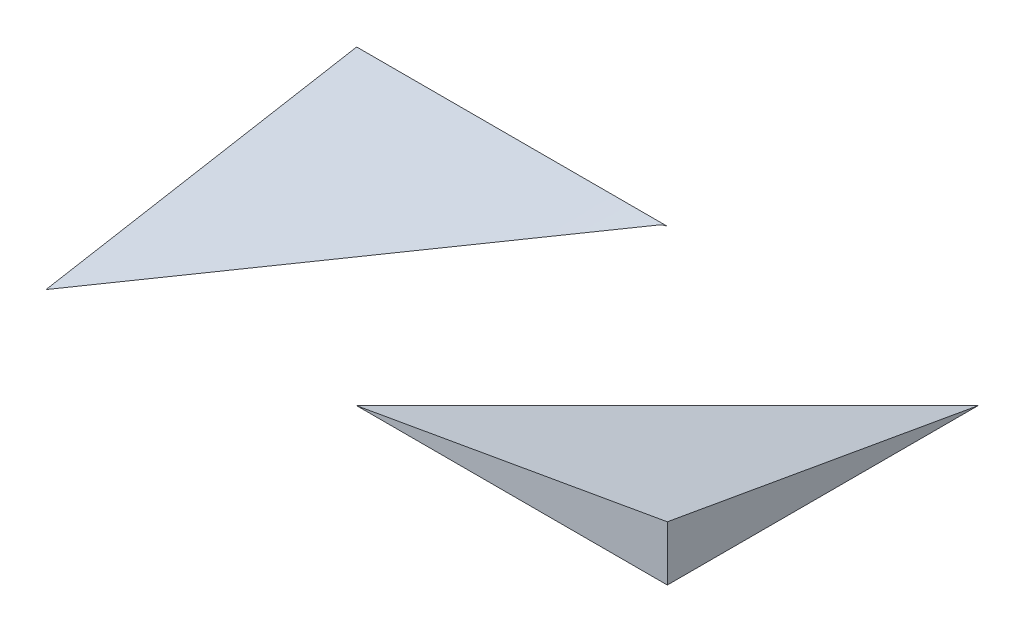
ISO-10303-21;
HEADER;
FILE_DESCRIPTION(('STEP AP214'),'2;1');
FILE_NAME('part.step','',(''),(''),'','','');
FILE_SCHEMA(('AUTOMOTIVE_DESIGN { 1 0 10303 214 1 1 1 1 }'));
ENDSEC;
DATA;
#1=APPLICATION_CONTEXT('core data for automotive mechanical design processes');
#2=APPLICATION_PROTOCOL_DEFINITION('international standard','automotive_design',2000,#1);
#3=PRODUCT_CONTEXT('',#1,'mechanical');
#4=PRODUCT('Part','Part','',(#3));
#5=PRODUCT_RELATED_PRODUCT_CATEGORY('part','',(#4));
#6=PRODUCT_DEFINITION_FORMATION('','',#4);
#7=PRODUCT_DEFINITION_CONTEXT('part definition',#1,'design');
#8=PRODUCT_DEFINITION('design','',#6,#7);
#9=PRODUCT_DEFINITION_SHAPE('','',#8);
#10=(LENGTH_UNIT() NAMED_UNIT(*) SI_UNIT(.MILLI.,.METRE.));
#11=(NAMED_UNIT(*) PLANE_ANGLE_UNIT() SI_UNIT($,.RADIAN.));
#12=(NAMED_UNIT(*) SI_UNIT($,.STERADIAN.) SOLID_ANGLE_UNIT());
#13=UNCERTAINTY_MEASURE_WITH_UNIT(LENGTH_MEASURE(1.E-05),#10,'distance_accuracy_value','');
#14=(GEOMETRIC_REPRESENTATION_CONTEXT(3) GLOBAL_UNCERTAINTY_ASSIGNED_CONTEXT((#13)) GLOBAL_UNIT_ASSIGNED_CONTEXT((#10,
#11,#12)) REPRESENTATION_CONTEXT('',''));
#15=CARTESIAN_POINT('',(0.,0.,0.));
#16=DIRECTION('',(0.,0.,1.));
#17=DIRECTION('',(1.,0.,0.));
#18=AXIS2_PLACEMENT_3D('',#15,#16,#17);
#19=CARTESIAN_POINT('',(0.,0.,-172.341356777135));
#20=DIRECTION('',(0.,0.,1.));
#21=DIRECTION('',(1.,0.,0.));
#22=AXIS2_PLACEMENT_3D('',#19,#20,#21);
#23=PLANE('',#22);
#24=DIRECTION('',(-1.,0.,0.));
#25=VECTOR('',#24,1.);
#26=CARTESIAN_POINT('',(0.,0.,-172.341356777135));
#27=LINE('',#26,#25);
#28=CARTESIAN_POINT('',(0.,0.,-172.341356777135));
#29=VERTEX_POINT('',#28);
#30=CARTESIAN_POINT('',(-172.341356777136,0.,-172.341356777135));
#31=VERTEX_POINT('',#30);
#32=EDGE_CURVE('E103',#29,#31,#27,.T.);
#33=ORIENTED_EDGE('',*,*,#32,.F.);
#34=DIRECTION('',(0.984807753012208,0.173648177666931,0.));
#35=VECTOR('',#34,1.);
#36=CARTESIAN_POINT('',(-172.341356777136,-30.3884310917129,-172.341356777135));
#37=LINE('',#36,#35);
#38=CARTESIAN_POINT('',(-2.61825245836941,-0.461668550716797,-172.341356777135));
#39=VERTEX_POINT('',#38);
#40=EDGE_CURVE('E74',#39,#29,#37,.T.);
#41=ORIENTED_EDGE('',*,*,#40,.F.);
#42=CARTESIAN_POINT('',(-172.341356777136,-30.3884310917129,-172.341356777135));
#43=VERTEX_POINT('',#42);
#44=EDGE_CURVE('E13',#43,#39,#37,.T.);
#45=ORIENTED_EDGE('',*,*,#44,.F.);
#46=DIRECTION('',(0.,-1.,0.));
#47=VECTOR('',#46,1.);
#48=CARTESIAN_POINT('',(-172.341356777136,0.,-172.341356777135));
#49=LINE('',#48,#47);
#50=EDGE_CURVE('E114',#31,#43,#49,.T.);
#51=ORIENTED_EDGE('',*,*,#50,.F.);
#52=EDGE_LOOP('',(#33,#41,#45,#51));
#53=FACE_BOUND('',#52,.T.);
#54=ADVANCED_FACE('F64',(#53),#23,.F.);
#55=CARTESIAN_POINT('',(0.,0.,0.));
#56=DIRECTION('',(0.173648177666931,-0.984807753012208,0.));
#57=DIRECTION('',(0.984807753012208,0.173648177666931,0.));
#58=AXIS2_PLACEMENT_3D('',#55,#56,#57);
#59=PLANE('',#58);
#60=ORIENTED_EDGE('',*,*,#44,.T.);
#61=DIRECTION('',(0.696364240320023,0.122787803968974,-0.707106781186544));
#62=VECTOR('',#61,1.);
#63=CARTESIAN_POINT('',(-2.61825245836943,-0.461668550716798,-172.341356777135));
#64=LINE('',#63,#62);
#65=CARTESIAN_POINT('',(-172.341356777136,-30.3884310917129,0.));
#66=VERTEX_POINT('',#65);
#67=EDGE_CURVE('E100',#66,#39,#64,.T.);
#68=ORIENTED_EDGE('',*,*,#67,.F.);
#69=DIRECTION('',(0.,0.,1.));
#70=VECTOR('',#69,1.);
#71=CARTESIAN_POINT('',(-172.341356777136,-30.3884310917129,-172.341356777135));
#72=LINE('',#71,#70);
#73=EDGE_CURVE('E108',#43,#66,#72,.T.);
#74=ORIENTED_EDGE('',*,*,#73,.F.);
#75=EDGE_LOOP('',(#60,#68,#74));
#76=FACE_BOUND('',#75,.T.);
#77=ADVANCED_FACE('F120',(#76),#59,.T.);
#78=CARTESIAN_POINT('',(-172.341356777136,-30.3884310917129,-172.341356777135));
#79=DIRECTION('',(-1.,0.,0.));
#80=DIRECTION('',(0.,0.,1.));
#81=AXIS2_PLACEMENT_3D('',#78,#79,#80);
#82=PLANE('',#81);
#83=ORIENTED_EDGE('',*,*,#73,.T.);
#84=DIRECTION('',(0.,0.173648177666932,-0.984807753012208));
#85=VECTOR('',#84,1.);
#86=CARTESIAN_POINT('',(-172.341356777136,-15.1942155458564,-86.1706783885673));
#87=LINE('',#86,#85);
#88=EDGE_CURVE('E96',#66,#31,#87,.T.);
#89=ORIENTED_EDGE('',*,*,#88,.T.);
#90=ORIENTED_EDGE('',*,*,#50,.T.);
#91=EDGE_LOOP('',(#83,#89,#90));
#92=FACE_BOUND('',#91,.T.);
#93=ADVANCED_FACE('F113',(#92),#82,.T.);
#94=CARTESIAN_POINT('',(-172.341356777136,-30.3884310917129,0.));
#95=CARTESIAN_POINT('',(-172.341356777136,0.,-172.341356777135));
#96=CARTESIAN_POINT('',(-144.054172724008,-25.4006373348802,-28.723559462856));
#97=CARTESIAN_POINT('',(-143.61779731428,0.,-172.341356777135));
#98=CARTESIAN_POINT('',(-115.76698867088,-20.4128435780475,-57.4471189257118));
#99=CARTESIAN_POINT('',(-114.894237851424,0.,-172.341356777135));
#100=CARTESIAN_POINT('',(-59.1926205646248,-10.4372560643821,-114.894237851423));
#101=CARTESIAN_POINT('',(-57.4471189257121,0.,-172.341356777135));
#102=CARTESIAN_POINT('',(-30.9054365114971,-5.44946230754945,-143.617797314279));
#103=CARTESIAN_POINT('',(-28.7235594628561,0.,-172.341356777135));
#104=CARTESIAN_POINT('',(-2.61825245836943,-0.461668550716798,-172.341356777135));
#105=CARTESIAN_POINT('',(0.,0.,-172.341356777135));
#106=B_SPLINE_SURFACE_WITH_KNOTS('',3,1,((#94,#95),(#96,#97),(#98,#99),(#100,#101),(#102,#103),
(#104,#105)),.UNSPECIFIED.,.F.,.F.,.F.,(4,2,4),(2,2),(0.,0.5,1.),(0.,1.),.UNSPECIFIED.);
#107=ORIENTED_EDGE('',*,*,#67,.T.);
#108=ORIENTED_EDGE('',*,*,#40,.T.);
#109=ORIENTED_EDGE('',*,*,#32,.T.);
#110=ORIENTED_EDGE('',*,*,#88,.F.);
#111=EDGE_LOOP('',(#107,#108,#109,#110));
#112=FACE_BOUND('',#111,.T.);
#113=ADVANCED_FACE('F99',(#112),#106,.T.);
#114=CLOSED_SHELL('',(#54,#77,#93,#113));
#115=MANIFOLD_SOLID_BREP('B2',#114);
#116=CARTESIAN_POINT('',(0.,0.,0.));
#117=DIRECTION('',(0.,0.,-1.));
#118=DIRECTION('',(-1.,0.,0.));
#119=AXIS2_PLACEMENT_3D('',#116,#117,#118);
#120=PLANE('',#119);
#121=DIRECTION('',(1.,0.,0.));
#122=VECTOR('',#121,1.);
#123=CARTESIAN_POINT('',(0.,0.,0.));
#124=LINE('',#123,#122);
#125=CARTESIAN_POINT('',(0.,0.,0.));
#126=VERTEX_POINT('',#125);
#127=CARTESIAN_POINT('',(172.341356777136,0.,0.));
#128=VERTEX_POINT('',#127);
#129=EDGE_CURVE('E308',#126,#128,#124,.T.);
#130=ORIENTED_EDGE('',*,*,#129,.T.);
#131=DIRECTION('',(0.,1.,0.));
#132=VECTOR('',#131,1.);
#133=CARTESIAN_POINT('',(172.341356777136,30.3884310917129,0.));
#134=LINE('',#133,#132);
#135=CARTESIAN_POINT('',(172.341356777136,30.3884310917129,0.));
#136=VERTEX_POINT('',#135);
#137=EDGE_CURVE('E301',#128,#136,#134,.T.);
#138=ORIENTED_EDGE('',*,*,#137,.T.);
#139=DIRECTION('',(-0.984807753012208,-0.173648177666931,0.));
#140=VECTOR('',#139,1.);
#141=CARTESIAN_POINT('',(0.,0.,0.));
#142=LINE('',#141,#140);
#143=EDGE_CURVE('E62',#136,#126,#142,.T.);
#144=ORIENTED_EDGE('',*,*,#143,.T.);
#145=EDGE_LOOP('',(#130,#138,#144));
#146=FACE_BOUND('',#145,.T.);
#147=ADVANCED_FACE('F290',(#146),#120,.F.);
#148=CARTESIAN_POINT('',(0.,0.,0.));
#149=DIRECTION('',(0.,1.,0.));
#150=DIRECTION('',(0.,0.,1.));
#151=AXIS2_PLACEMENT_3D('',#148,#149,#150);
#152=PLANE('',#151);
#153=ORIENTED_EDGE('',*,*,#129,.F.);
#154=DIRECTION('',(-0.707106781186551,0.,0.707106781186544));
#155=VECTOR('',#154,1.);
#156=CARTESIAN_POINT('',(172.341356777136,0.,-172.341356777135));
#157=LINE('',#156,#155);
#158=CARTESIAN_POINT('',(172.341356777136,0.,-172.341356777135));
#159=VERTEX_POINT('',#158);
#160=EDGE_CURVE('E318',#159,#126,#157,.T.);
#161=ORIENTED_EDGE('',*,*,#160,.F.);
#162=DIRECTION('',(0.,0.,-1.));
#163=VECTOR('',#162,1.);
#164=CARTESIAN_POINT('',(172.341356777136,0.,0.));
#165=LINE('',#164,#163);
#166=EDGE_CURVE('E322',#128,#159,#165,.T.);
#167=ORIENTED_EDGE('',*,*,#166,.F.);
#168=EDGE_LOOP('',(#153,#161,#167));
#169=FACE_BOUND('',#168,.T.);
#170=ADVANCED_FACE('F321',(#169),#152,.F.);
#171=CARTESIAN_POINT('',(172.341356777136,0.,-172.341356777135));
#172=DIRECTION('',(-0.171087869746036,0.970287525247813,-0.171087869746038));
#173=DIRECTION('',(-0.707106781186551,0.,0.707106781186544));
#174=AXIS2_PLACEMENT_3D('',#171,#172,#173);
#175=PLANE('',#174);
#176=ORIENTED_EDGE('',*,*,#160,.T.);
#177=ORIENTED_EDGE('',*,*,#143,.F.);
#178=DIRECTION('',(0.,-0.173648177666933,-0.984807753012208));
#179=VECTOR('',#178,1.);
#180=CARTESIAN_POINT('',(172.341356777136,15.1942155458564,-86.1706783885673));
#181=LINE('',#180,#179);
#182=EDGE_CURVE('E329',#136,#159,#181,.T.);
#183=ORIENTED_EDGE('',*,*,#182,.T.);
#184=EDGE_LOOP('',(#176,#177,#183));
#185=FACE_BOUND('',#184,.T.);
#186=ADVANCED_FACE('F344',(#185),#175,.T.);
#187=CARTESIAN_POINT('',(172.341356777136,0.,0.));
#188=DIRECTION('',(1.,0.,0.));
#189=DIRECTION('',(0.,0.,-1.));
#190=AXIS2_PLACEMENT_3D('',#187,#188,#189);
#191=PLANE('',#190);
#192=ORIENTED_EDGE('',*,*,#166,.T.);
#193=ORIENTED_EDGE('',*,*,#182,.F.);
#194=ORIENTED_EDGE('',*,*,#137,.F.);
#195=EDGE_LOOP('',(#192,#193,#194));
#196=FACE_BOUND('',#195,.T.);
#197=ADVANCED_FACE('F336',(#196),#191,.T.);
#198=CLOSED_SHELL('',(#147,#170,#186,#197));
#199=MANIFOLD_SOLID_BREP('B7',#198);
#200=ADVANCED_BREP_SHAPE_REPRESENTATION('',(#18,#115,#199),#14);
#201=SHAPE_DEFINITION_REPRESENTATION(#9,#200);
ENDSEC;
END-ISO-10303-21;
